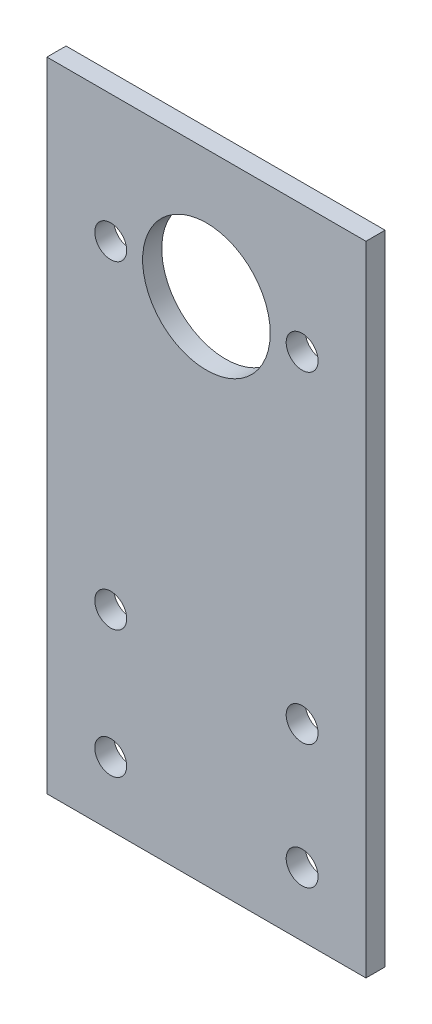
ISO-10303-21;
HEADER;
FILE_DESCRIPTION(('STEP AP214'),'2;1');
FILE_NAME('part.step','',(''),(''),'','','');
FILE_SCHEMA(('AUTOMOTIVE_DESIGN { 1 0 10303 214 1 1 1 1 }'));
ENDSEC;
DATA;
#1=APPLICATION_CONTEXT('core data for automotive mechanical design processes');
#2=APPLICATION_PROTOCOL_DEFINITION('international standard','automotive_design',2000,#1);
#3=PRODUCT_CONTEXT('',#1,'mechanical');
#4=PRODUCT('Part','Part','',(#3));
#5=PRODUCT_RELATED_PRODUCT_CATEGORY('part','',(#4));
#6=PRODUCT_DEFINITION_FORMATION('','',#4);
#7=PRODUCT_DEFINITION_CONTEXT('part definition',#1,'design');
#8=PRODUCT_DEFINITION('design','',#6,#7);
#9=PRODUCT_DEFINITION_SHAPE('','',#8);
#10=(LENGTH_UNIT() NAMED_UNIT(*) SI_UNIT(.MILLI.,.METRE.));
#11=(NAMED_UNIT(*) PLANE_ANGLE_UNIT() SI_UNIT($,.RADIAN.));
#12=(NAMED_UNIT(*) SI_UNIT($,.STERADIAN.) SOLID_ANGLE_UNIT());
#13=UNCERTAINTY_MEASURE_WITH_UNIT(LENGTH_MEASURE(1.E-05),#10,'distance_accuracy_value','');
#14=(GEOMETRIC_REPRESENTATION_CONTEXT(3) GLOBAL_UNCERTAINTY_ASSIGNED_CONTEXT((#13)) GLOBAL_UNIT_ASSIGNED_CONTEXT((#10,
#11,#12)) REPRESENTATION_CONTEXT('',''));
#15=CARTESIAN_POINT('',(0.,0.,0.));
#16=DIRECTION('',(0.,0.,1.));
#17=DIRECTION('',(1.,0.,0.));
#18=AXIS2_PLACEMENT_3D('',#15,#16,#17);
#19=CARTESIAN_POINT('',(0.,0.,3.));
#20=DIRECTION('',(0.,0.,1.));
#21=DIRECTION('',(1.,0.,0.));
#22=AXIS2_PLACEMENT_3D('',#19,#20,#21);
#23=PLANE('',#22);
#24=CARTESIAN_POINT('',(23.2161702809244,36.0091743119266,3.));
#25=DIRECTION('',(0.,0.,1.));
#26=DIRECTION('',(1.,0.,0.));
#27=AXIS2_PLACEMENT_3D('',#24,#25,#26);
#28=CIRCLE('',#27,2.5);
#29=CARTESIAN_POINT('',(25.7161702809244,36.0091743119266,3.));
#30=VERTEX_POINT('',#29);
#31=EDGE_CURVE('E142',#30,#30,#28,.T.);
#32=ORIENTED_EDGE('',*,*,#31,.F.);
#33=EDGE_LOOP('',(#32));
#34=FACE_BOUND('',#33,.T.);
#35=CARTESIAN_POINT('',(-6.78382971907558,36.0091743119266,3.));
#36=DIRECTION('',(0.,0.,1.));
#37=DIRECTION('',(1.,0.,0.));
#38=AXIS2_PLACEMENT_3D('',#35,#36,#37);
#39=CIRCLE('',#38,2.5);
#40=CARTESIAN_POINT('',(-4.28382971907558,36.0091743119266,3.));
#41=VERTEX_POINT('',#40);
#42=EDGE_CURVE('E148',#41,#41,#39,.T.);
#43=ORIENTED_EDGE('',*,*,#42,.F.);
#44=EDGE_LOOP('',(#43));
#45=FACE_BOUND('',#44,.T.);
#46=CARTESIAN_POINT('',(8.21617028092442,36.0091743119266,3.));
#47=DIRECTION('',(0.,0.,1.));
#48=DIRECTION('',(1.,0.,0.));
#49=AXIS2_PLACEMENT_3D('',#46,#47,#48);
#50=CIRCLE('',#49,10.);
#51=CARTESIAN_POINT('',(18.2161702809244,36.0091743119266,3.));
#52=VERTEX_POINT('',#51);
#53=EDGE_CURVE('E136',#52,#52,#50,.T.);
#54=ORIENTED_EDGE('',*,*,#53,.F.);
#55=EDGE_LOOP('',(#54));
#56=FACE_BOUND('',#55,.T.);
#57=CARTESIAN_POINT('',(23.2161702809244,-14.5243189734724,3.));
#58=DIRECTION('',(0.,0.,1.));
#59=DIRECTION('',(1.,0.,0.));
#60=AXIS2_PLACEMENT_3D('',#57,#58,#59);
#61=CIRCLE('',#60,2.5);
#62=CARTESIAN_POINT('',(25.7161702809244,-14.5243189734724,3.));
#63=VERTEX_POINT('',#62);
#64=EDGE_CURVE('E121',#63,#63,#61,.T.);
#65=ORIENTED_EDGE('',*,*,#64,.F.);
#66=EDGE_LOOP('',(#65));
#67=FACE_BOUND('',#66,.T.);
#68=CARTESIAN_POINT('',(23.2161702809244,-33.9908256880734,3.));
#69=DIRECTION('',(0.,0.,1.));
#70=DIRECTION('',(1.,0.,0.));
#71=AXIS2_PLACEMENT_3D('',#68,#69,#70);
#72=CIRCLE('',#71,2.5);
#73=CARTESIAN_POINT('',(25.7161702809244,-33.9908256880734,3.));
#74=VERTEX_POINT('',#73);
#75=EDGE_CURVE('E100',#74,#74,#72,.T.);
#76=ORIENTED_EDGE('',*,*,#75,.F.);
#77=EDGE_LOOP('',(#76));
#78=FACE_BOUND('',#77,.T.);
#79=DIRECTION('',(0.,-1.,0.));
#80=VECTOR('',#79,1.);
#81=CARTESIAN_POINT('',(-16.7838297190756,56.0091743119266,3.));
#82=LINE('',#81,#80);
#83=CARTESIAN_POINT('',(-16.7838297190756,56.0091743119266,3.));
#84=VERTEX_POINT('',#83);
#85=CARTESIAN_POINT('',(-16.7838297190756,-43.9908256880734,3.));
#86=VERTEX_POINT('',#85);
#87=EDGE_CURVE('E85',#84,#86,#82,.T.);
#88=ORIENTED_EDGE('',*,*,#87,.T.);
#89=DIRECTION('',(1.,0.,0.));
#90=VECTOR('',#89,1.);
#91=CARTESIAN_POINT('',(-16.7838297190756,-43.9908256880734,3.));
#92=LINE('',#91,#90);
#93=CARTESIAN_POINT('',(33.2161702809244,-43.9908256880734,3.));
#94=VERTEX_POINT('',#93);
#95=EDGE_CURVE('E80',#86,#94,#92,.T.);
#96=ORIENTED_EDGE('',*,*,#95,.T.);
#97=DIRECTION('',(0.,1.,0.));
#98=VECTOR('',#97,1.);
#99=CARTESIAN_POINT('',(33.2161702809244,56.0091743119266,3.));
#100=LINE('',#99,#98);
#101=CARTESIAN_POINT('',(33.2161702809244,56.0091743119266,3.));
#102=VERTEX_POINT('',#101);
#103=EDGE_CURVE('E83',#94,#102,#100,.T.);
#104=ORIENTED_EDGE('',*,*,#103,.T.);
#105=DIRECTION('',(-1.,0.,0.));
#106=VECTOR('',#105,1.);
#107=CARTESIAN_POINT('',(-16.7838297190756,56.0091743119266,3.));
#108=LINE('',#107,#106);
#109=EDGE_CURVE('E50',#102,#84,#108,.T.);
#110=ORIENTED_EDGE('',*,*,#109,.T.);
#111=EDGE_LOOP('',(#88,#96,#104,#110));
#112=FACE_BOUND('',#111,.T.);
#113=CARTESIAN_POINT('',(-6.78382971907557,-33.9908256880734,3.));
#114=DIRECTION('',(0.,0.,1.));
#115=DIRECTION('',(1.,0.,0.));
#116=AXIS2_PLACEMENT_3D('',#113,#114,#115);
#117=CIRCLE('',#116,2.5);
#118=CARTESIAN_POINT('',(-4.28382971907557,-33.9908256880734,3.));
#119=VERTEX_POINT('',#118);
#120=EDGE_CURVE('E115',#119,#119,#117,.T.);
#121=ORIENTED_EDGE('',*,*,#120,.F.);
#122=EDGE_LOOP('',(#121));
#123=FACE_BOUND('',#122,.T.);
#124=CARTESIAN_POINT('',(-6.78382971907557,-13.9908256880734,3.));
#125=DIRECTION('',(0.,0.,1.));
#126=DIRECTION('',(1.,0.,0.));
#127=AXIS2_PLACEMENT_3D('',#124,#125,#126);
#128=CIRCLE('',#127,2.5);
#129=CARTESIAN_POINT('',(-4.28382971907557,-13.9908256880734,3.));
#130=VERTEX_POINT('',#129);
#131=EDGE_CURVE('E127',#130,#130,#128,.T.);
#132=ORIENTED_EDGE('',*,*,#131,.F.);
#133=EDGE_LOOP('',(#132));
#134=FACE_BOUND('',#133,.T.);
#135=ADVANCED_FACE('F33',(#34,#45,#56,#67,#78,#112,#123,#134),#23,.T.);
#136=CARTESIAN_POINT('',(0.,0.,0.));
#137=DIRECTION('',(0.,0.,1.));
#138=DIRECTION('',(1.,0.,0.));
#139=AXIS2_PLACEMENT_3D('',#136,#137,#138);
#140=PLANE('',#139);
#141=CARTESIAN_POINT('',(23.2161702809244,36.0091743119266,0.));
#142=DIRECTION('',(0.,0.,1.));
#143=DIRECTION('',(1.,0.,0.));
#144=AXIS2_PLACEMENT_3D('',#141,#142,#143);
#145=CIRCLE('',#144,2.5);
#146=CARTESIAN_POINT('',(25.7161702809244,36.0091743119266,0.));
#147=VERTEX_POINT('',#146);
#148=EDGE_CURVE('E145',#147,#147,#145,.T.);
#149=ORIENTED_EDGE('',*,*,#148,.T.);
#150=EDGE_LOOP('',(#149));
#151=FACE_BOUND('',#150,.T.);
#152=CARTESIAN_POINT('',(-6.78382971907558,36.0091743119266,0.));
#153=DIRECTION('',(0.,0.,1.));
#154=DIRECTION('',(1.,0.,0.));
#155=AXIS2_PLACEMENT_3D('',#152,#153,#154);
#156=CIRCLE('',#155,2.5);
#157=CARTESIAN_POINT('',(-4.28382971907558,36.0091743119266,0.));
#158=VERTEX_POINT('',#157);
#159=EDGE_CURVE('E139',#158,#158,#156,.T.);
#160=ORIENTED_EDGE('',*,*,#159,.T.);
#161=EDGE_LOOP('',(#160));
#162=FACE_BOUND('',#161,.T.);
#163=CARTESIAN_POINT('',(8.21617028092442,36.0091743119266,0.));
#164=DIRECTION('',(0.,0.,1.));
#165=DIRECTION('',(1.,0.,0.));
#166=AXIS2_PLACEMENT_3D('',#163,#164,#165);
#167=CIRCLE('',#166,10.);
#168=CARTESIAN_POINT('',(18.2161702809244,36.0091743119266,0.));
#169=VERTEX_POINT('',#168);
#170=EDGE_CURVE('E133',#169,#169,#167,.T.);
#171=ORIENTED_EDGE('',*,*,#170,.T.);
#172=EDGE_LOOP('',(#171));
#173=FACE_BOUND('',#172,.T.);
#174=DIRECTION('',(0.,-1.,0.));
#175=VECTOR('',#174,1.);
#176=CARTESIAN_POINT('',(-16.7838297190756,56.0091743119266,0.));
#177=LINE('',#176,#175);
#178=CARTESIAN_POINT('',(-16.7838297190756,56.0091743119266,0.));
#179=VERTEX_POINT('',#178);
#180=CARTESIAN_POINT('',(-16.7838297190756,-43.9908256880734,0.));
#181=VERTEX_POINT('',#180);
#182=EDGE_CURVE('E97',#179,#181,#177,.T.);
#183=ORIENTED_EDGE('',*,*,#182,.F.);
#184=DIRECTION('',(-1.,0.,0.));
#185=VECTOR('',#184,1.);
#186=CARTESIAN_POINT('',(-16.7838297190756,56.0091743119266,0.));
#187=LINE('',#186,#185);
#188=CARTESIAN_POINT('',(33.2161702809244,56.0091743119266,0.));
#189=VERTEX_POINT('',#188);
#190=EDGE_CURVE('E73',#189,#179,#187,.T.);
#191=ORIENTED_EDGE('',*,*,#190,.F.);
#192=DIRECTION('',(0.,1.,0.));
#193=VECTOR('',#192,1.);
#194=CARTESIAN_POINT('',(33.2161702809244,56.0091743119266,0.));
#195=LINE('',#194,#193);
#196=CARTESIAN_POINT('',(33.2161702809244,-43.9908256880734,0.));
#197=VERTEX_POINT('',#196);
#198=EDGE_CURVE('E67',#197,#189,#195,.T.);
#199=ORIENTED_EDGE('',*,*,#198,.F.);
#200=DIRECTION('',(1.,0.,0.));
#201=VECTOR('',#200,1.);
#202=CARTESIAN_POINT('',(-16.7838297190756,-43.9908256880734,0.));
#203=LINE('',#202,#201);
#204=EDGE_CURVE('E89',#181,#197,#203,.T.);
#205=ORIENTED_EDGE('',*,*,#204,.F.);
#206=EDGE_LOOP('',(#183,#191,#199,#205));
#207=FACE_BOUND('',#206,.T.);
#208=CARTESIAN_POINT('',(23.2161702809244,-33.9908256880734,0.));
#209=DIRECTION('',(0.,0.,1.));
#210=DIRECTION('',(1.,0.,0.));
#211=AXIS2_PLACEMENT_3D('',#208,#209,#210);
#212=CIRCLE('',#211,2.5);
#213=CARTESIAN_POINT('',(25.7161702809244,-33.9908256880734,0.));
#214=VERTEX_POINT('',#213);
#215=EDGE_CURVE('E112',#214,#214,#212,.T.);
#216=ORIENTED_EDGE('',*,*,#215,.T.);
#217=EDGE_LOOP('',(#216));
#218=FACE_BOUND('',#217,.T.);
#219=CARTESIAN_POINT('',(-6.78382971907557,-33.9908256880734,0.));
#220=DIRECTION('',(0.,0.,1.));
#221=DIRECTION('',(1.,0.,0.));
#222=AXIS2_PLACEMENT_3D('',#219,#220,#221);
#223=CIRCLE('',#222,2.5);
#224=CARTESIAN_POINT('',(-4.28382971907557,-33.9908256880734,0.));
#225=VERTEX_POINT('',#224);
#226=EDGE_CURVE('E118',#225,#225,#223,.T.);
#227=ORIENTED_EDGE('',*,*,#226,.T.);
#228=EDGE_LOOP('',(#227));
#229=FACE_BOUND('',#228,.T.);
#230=CARTESIAN_POINT('',(23.2161702809244,-14.5243189734724,0.));
#231=DIRECTION('',(0.,0.,1.));
#232=DIRECTION('',(1.,0.,0.));
#233=AXIS2_PLACEMENT_3D('',#230,#231,#232);
#234=CIRCLE('',#233,2.5);
#235=CARTESIAN_POINT('',(25.7161702809244,-14.5243189734724,0.));
#236=VERTEX_POINT('',#235);
#237=EDGE_CURVE('E124',#236,#236,#234,.T.);
#238=ORIENTED_EDGE('',*,*,#237,.T.);
#239=EDGE_LOOP('',(#238));
#240=FACE_BOUND('',#239,.T.);
#241=CARTESIAN_POINT('',(-6.78382971907557,-13.9908256880734,0.));
#242=DIRECTION('',(0.,0.,1.));
#243=DIRECTION('',(1.,0.,0.));
#244=AXIS2_PLACEMENT_3D('',#241,#242,#243);
#245=CIRCLE('',#244,2.5);
#246=CARTESIAN_POINT('',(-4.28382971907557,-13.9908256880734,0.));
#247=VERTEX_POINT('',#246);
#248=EDGE_CURVE('E130',#247,#247,#245,.T.);
#249=ORIENTED_EDGE('',*,*,#248,.T.);
#250=EDGE_LOOP('',(#249));
#251=FACE_BOUND('',#250,.T.);
#252=ADVANCED_FACE('F108',(#151,#162,#173,#207,#218,#229,#240,#251),#140,.F.);
#253=CARTESIAN_POINT('',(-16.7838297190756,56.0091743119266,3.));
#254=DIRECTION('',(1.,0.,0.));
#255=DIRECTION('',(0.,1.,0.));
#256=AXIS2_PLACEMENT_3D('',#253,#254,#255);
#257=PLANE('',#256);
#258=ORIENTED_EDGE('',*,*,#182,.T.);
#259=DIRECTION('',(0.,0.,-1.));
#260=VECTOR('',#259,1.);
#261=CARTESIAN_POINT('',(-16.7838297190756,-43.9908256880734,3.));
#262=LINE('',#261,#260);
#263=EDGE_CURVE('E11',#86,#181,#262,.T.);
#264=ORIENTED_EDGE('',*,*,#263,.F.);
#265=ORIENTED_EDGE('',*,*,#87,.F.);
#266=DIRECTION('',(0.,0.,-1.));
#267=VECTOR('',#266,1.);
#268=CARTESIAN_POINT('',(-16.7838297190756,56.0091743119266,3.));
#269=LINE('',#268,#267);
#270=EDGE_CURVE('E93',#84,#179,#269,.T.);
#271=ORIENTED_EDGE('',*,*,#270,.T.);
#272=EDGE_LOOP('',(#258,#264,#265,#271));
#273=FACE_BOUND('',#272,.T.);
#274=ADVANCED_FACE('F35',(#273),#257,.F.);
#275=CARTESIAN_POINT('',(-16.7838297190756,-43.9908256880734,3.));
#276=DIRECTION('',(0.,1.,0.));
#277=DIRECTION('',(0.,0.,1.));
#278=AXIS2_PLACEMENT_3D('',#275,#276,#277);
#279=PLANE('',#278);
#280=ORIENTED_EDGE('',*,*,#204,.T.);
#281=DIRECTION('',(0.,0.,-1.));
#282=VECTOR('',#281,1.);
#283=CARTESIAN_POINT('',(33.2161702809244,-43.9908256880734,3.));
#284=LINE('',#283,#282);
#285=EDGE_CURVE('E42',#94,#197,#284,.T.);
#286=ORIENTED_EDGE('',*,*,#285,.F.);
#287=ORIENTED_EDGE('',*,*,#95,.F.);
#288=ORIENTED_EDGE('',*,*,#263,.T.);
#289=EDGE_LOOP('',(#280,#286,#287,#288));
#290=FACE_BOUND('',#289,.T.);
#291=ADVANCED_FACE('F88',(#290),#279,.F.);
#292=CARTESIAN_POINT('',(33.2161702809244,56.0091743119266,3.));
#293=DIRECTION('',(-1.,0.,0.));
#294=DIRECTION('',(0.,-1.,0.));
#295=AXIS2_PLACEMENT_3D('',#292,#293,#294);
#296=PLANE('',#295);
#297=ORIENTED_EDGE('',*,*,#198,.T.);
#298=DIRECTION('',(0.,0.,-1.));
#299=VECTOR('',#298,1.);
#300=CARTESIAN_POINT('',(33.2161702809244,56.0091743119266,3.));
#301=LINE('',#300,#299);
#302=EDGE_CURVE('E90',#102,#189,#301,.T.);
#303=ORIENTED_EDGE('',*,*,#302,.F.);
#304=ORIENTED_EDGE('',*,*,#103,.F.);
#305=ORIENTED_EDGE('',*,*,#285,.T.);
#306=EDGE_LOOP('',(#297,#303,#304,#305));
#307=FACE_BOUND('',#306,.T.);
#308=ADVANCED_FACE('F91',(#307),#296,.F.);
#309=CARTESIAN_POINT('',(-16.7838297190756,56.0091743119266,3.));
#310=DIRECTION('',(0.,-1.,0.));
#311=DIRECTION('',(0.,0.,-1.));
#312=AXIS2_PLACEMENT_3D('',#309,#310,#311);
#313=PLANE('',#312);
#314=ORIENTED_EDGE('',*,*,#190,.T.);
#315=ORIENTED_EDGE('',*,*,#270,.F.);
#316=ORIENTED_EDGE('',*,*,#109,.F.);
#317=ORIENTED_EDGE('',*,*,#302,.T.);
#318=EDGE_LOOP('',(#314,#315,#316,#317));
#319=FACE_BOUND('',#318,.T.);
#320=ADVANCED_FACE('F105',(#319),#313,.F.);
#321=CARTESIAN_POINT('',(23.2161702809244,-33.9908256880734,3.));
#322=DIRECTION('',(0.,0.,-1.));
#323=DIRECTION('',(-1.,0.,0.));
#324=AXIS2_PLACEMENT_3D('',#321,#322,#323);
#325=CYLINDRICAL_SURFACE('',#324,2.5);
#326=ORIENTED_EDGE('',*,*,#75,.T.);
#327=EDGE_LOOP('',(#326));
#328=FACE_BOUND('',#327,.T.);
#329=ORIENTED_EDGE('',*,*,#215,.F.);
#330=EDGE_LOOP('',(#329));
#331=FACE_BOUND('',#330,.T.);
#332=ADVANCED_FACE('F174',(#328,#331),#325,.F.);
#333=CARTESIAN_POINT('',(-6.78382971907557,-33.9908256880734,3.));
#334=DIRECTION('',(0.,0.,-1.));
#335=DIRECTION('',(-1.,0.,0.));
#336=AXIS2_PLACEMENT_3D('',#333,#334,#335);
#337=CYLINDRICAL_SURFACE('',#336,2.5);
#338=ORIENTED_EDGE('',*,*,#120,.T.);
#339=EDGE_LOOP('',(#338));
#340=FACE_BOUND('',#339,.T.);
#341=ORIENTED_EDGE('',*,*,#226,.F.);
#342=EDGE_LOOP('',(#341));
#343=FACE_BOUND('',#342,.T.);
#344=ADVANCED_FACE('F177',(#340,#343),#337,.F.);
#345=CARTESIAN_POINT('',(23.2161702809244,-14.5243189734724,3.));
#346=DIRECTION('',(0.,0.,-1.));
#347=DIRECTION('',(-1.,0.,0.));
#348=AXIS2_PLACEMENT_3D('',#345,#346,#347);
#349=CYLINDRICAL_SURFACE('',#348,2.5);
#350=ORIENTED_EDGE('',*,*,#64,.T.);
#351=EDGE_LOOP('',(#350));
#352=FACE_BOUND('',#351,.T.);
#353=ORIENTED_EDGE('',*,*,#237,.F.);
#354=EDGE_LOOP('',(#353));
#355=FACE_BOUND('',#354,.T.);
#356=ADVANCED_FACE('F192',(#352,#355),#349,.F.);
#357=CARTESIAN_POINT('',(-6.78382971907557,-13.9908256880734,3.));
#358=DIRECTION('',(0.,0.,-1.));
#359=DIRECTION('',(-1.,0.,0.));
#360=AXIS2_PLACEMENT_3D('',#357,#358,#359);
#361=CYLINDRICAL_SURFACE('',#360,2.5);
#362=ORIENTED_EDGE('',*,*,#131,.T.);
#363=EDGE_LOOP('',(#362));
#364=FACE_BOUND('',#363,.T.);
#365=ORIENTED_EDGE('',*,*,#248,.F.);
#366=EDGE_LOOP('',(#365));
#367=FACE_BOUND('',#366,.T.);
#368=ADVANCED_FACE('F190',(#364,#367),#361,.F.);
#369=CARTESIAN_POINT('',(8.21617028092442,36.0091743119266,0.));
#370=DIRECTION('',(0.,0.,1.));
#371=DIRECTION('',(1.,0.,0.));
#372=AXIS2_PLACEMENT_3D('',#369,#370,#371);
#373=CYLINDRICAL_SURFACE('',#372,10.);
#374=ORIENTED_EDGE('',*,*,#170,.F.);
#375=EDGE_LOOP('',(#374));
#376=FACE_BOUND('',#375,.T.);
#377=ORIENTED_EDGE('',*,*,#53,.T.);
#378=EDGE_LOOP('',(#377));
#379=FACE_BOUND('',#378,.T.);
#380=ADVANCED_FACE('F160',(#376,#379),#373,.F.);
#381=CARTESIAN_POINT('',(-6.78382971907558,36.0091743119266,0.));
#382=DIRECTION('',(0.,0.,1.));
#383=DIRECTION('',(1.,0.,0.));
#384=AXIS2_PLACEMENT_3D('',#381,#382,#383);
#385=CYLINDRICAL_SURFACE('',#384,2.5);
#386=ORIENTED_EDGE('',*,*,#159,.F.);
#387=EDGE_LOOP('',(#386));
#388=FACE_BOUND('',#387,.T.);
#389=ORIENTED_EDGE('',*,*,#42,.T.);
#390=EDGE_LOOP('',(#389));
#391=FACE_BOUND('',#390,.T.);
#392=ADVANCED_FACE('F156',(#388,#391),#385,.F.);
#393=CARTESIAN_POINT('',(23.2161702809244,36.0091743119266,0.));
#394=DIRECTION('',(0.,0.,1.));
#395=DIRECTION('',(1.,0.,0.));
#396=AXIS2_PLACEMENT_3D('',#393,#394,#395);
#397=CYLINDRICAL_SURFACE('',#396,2.5);
#398=ORIENTED_EDGE('',*,*,#148,.F.);
#399=EDGE_LOOP('',(#398));
#400=FACE_BOUND('',#399,.T.);
#401=ORIENTED_EDGE('',*,*,#31,.T.);
#402=EDGE_LOOP('',(#401));
#403=FACE_BOUND('',#402,.T.);
#404=ADVANCED_FACE('F159',(#400,#403),#397,.F.);
#405=CLOSED_SHELL('',(#135,#252,#274,#291,#308,#320,#332,#344,#356,#368,#380,#392,#404));
#406=MANIFOLD_SOLID_BREP('B2',#405);
#407=ADVANCED_BREP_SHAPE_REPRESENTATION('',(#18,#406),#14);
#408=SHAPE_DEFINITION_REPRESENTATION(#9,#407);
ENDSEC;
END-ISO-10303-21;
